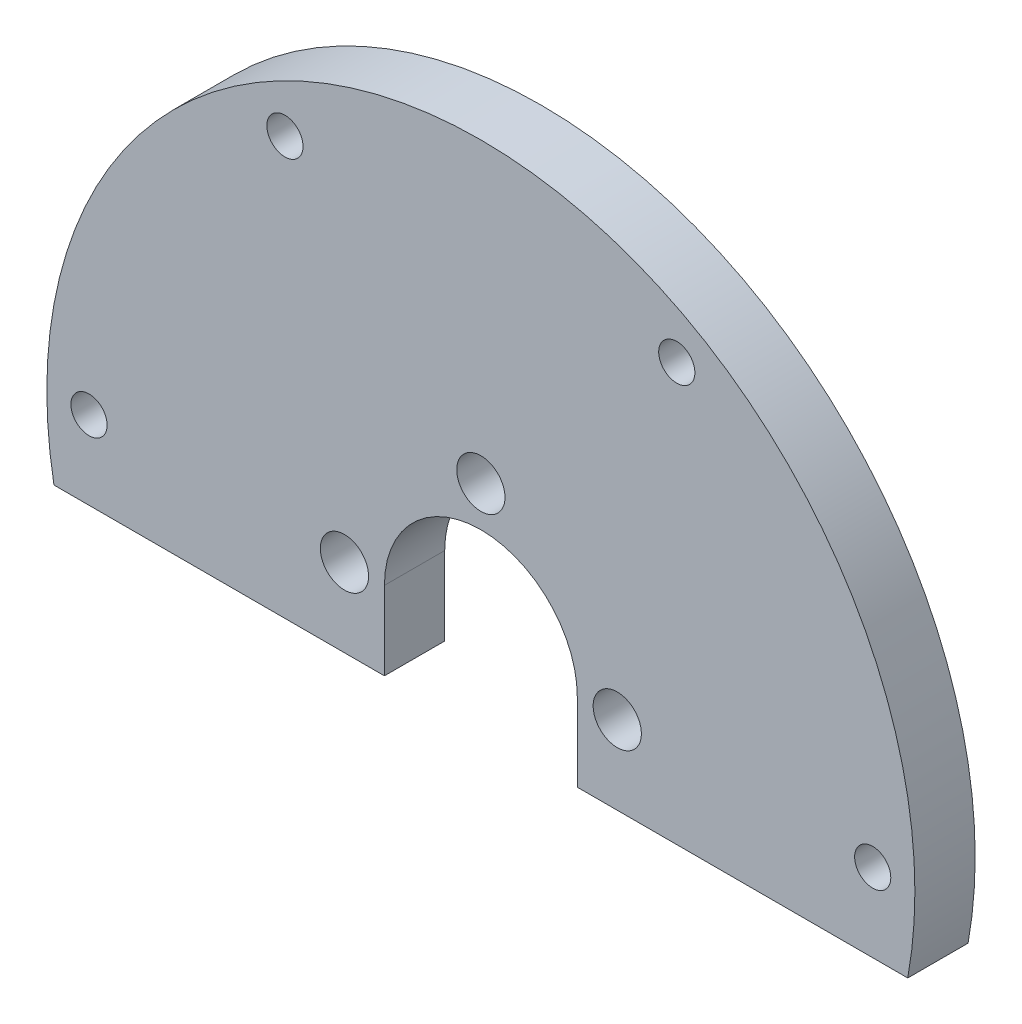
ISO-10303-21;
HEADER;
FILE_DESCRIPTION(('STEP AP214'),'2;1');
FILE_NAME('part.step','',(''),(''),'','','');
FILE_SCHEMA(('AUTOMOTIVE_DESIGN { 1 0 10303 214 1 1 1 1 }'));
ENDSEC;
DATA;
#1=APPLICATION_CONTEXT('core data for automotive mechanical design processes');
#2=APPLICATION_PROTOCOL_DEFINITION('international standard','automotive_design',2000,#1);
#3=PRODUCT_CONTEXT('',#1,'mechanical');
#4=PRODUCT('Part','Part','',(#3));
#5=PRODUCT_RELATED_PRODUCT_CATEGORY('part','',(#4));
#6=PRODUCT_DEFINITION_FORMATION('','',#4);
#7=PRODUCT_DEFINITION_CONTEXT('part definition',#1,'design');
#8=PRODUCT_DEFINITION('design','',#6,#7);
#9=PRODUCT_DEFINITION_SHAPE('','',#8);
#10=(LENGTH_UNIT() NAMED_UNIT(*) SI_UNIT(.MILLI.,.METRE.));
#11=(NAMED_UNIT(*) PLANE_ANGLE_UNIT() SI_UNIT($,.RADIAN.));
#12=(NAMED_UNIT(*) SI_UNIT($,.STERADIAN.) SOLID_ANGLE_UNIT());
#13=UNCERTAINTY_MEASURE_WITH_UNIT(LENGTH_MEASURE(1.E-05),#10,'distance_accuracy_value','');
#14=(GEOMETRIC_REPRESENTATION_CONTEXT(3) GLOBAL_UNCERTAINTY_ASSIGNED_CONTEXT((#13)) GLOBAL_UNIT_ASSIGNED_CONTEXT((#10,
#11,#12)) REPRESENTATION_CONTEXT('',''));
#15=CARTESIAN_POINT('',(0.,0.,0.));
#16=DIRECTION('',(0.,0.,1.));
#17=DIRECTION('',(1.,0.,0.));
#18=AXIS2_PLACEMENT_3D('',#15,#16,#17);
#19=CARTESIAN_POINT('',(-7.99860429450443,0.,5.));
#20=DIRECTION('',(1.,0.,0.));
#21=DIRECTION('',(0.,0.,-1.));
#22=AXIS2_PLACEMENT_3D('',#19,#20,#21);
#23=PLANE('',#22);
#24=DIRECTION('',(0.,-1.,0.));
#25=VECTOR('',#24,1.);
#26=CARTESIAN_POINT('',(-7.99860429450443,0.,0.));
#27=LINE('',#26,#25);
#28=CARTESIAN_POINT('',(-7.99860429450443,0.,0.));
#29=VERTEX_POINT('',#28);
#30=CARTESIAN_POINT('',(-7.99860429450443,-6.50000000000001,0.));
#31=VERTEX_POINT('',#30);
#32=EDGE_CURVE('E136',#29,#31,#27,.T.);
#33=ORIENTED_EDGE('',*,*,#32,.F.);
#34=DIRECTION('',(0.,0.,-1.));
#35=VECTOR('',#34,1.);
#36=CARTESIAN_POINT('',(-7.99860429450443,0.,5.));
#37=LINE('',#36,#35);
#38=CARTESIAN_POINT('',(-7.99860429450443,0.,5.));
#39=VERTEX_POINT('',#38);
#40=EDGE_CURVE('E11',#39,#29,#37,.T.);
#41=ORIENTED_EDGE('',*,*,#40,.F.);
#42=DIRECTION('',(0.,-1.,0.));
#43=VECTOR('',#42,1.);
#44=CARTESIAN_POINT('',(-7.99860429450443,0.,5.));
#45=LINE('',#44,#43);
#46=CARTESIAN_POINT('',(-7.99860429450443,-6.50000000000001,5.));
#47=VERTEX_POINT('',#46);
#48=EDGE_CURVE('E184',#39,#47,#45,.T.);
#49=ORIENTED_EDGE('',*,*,#48,.T.);
#50=DIRECTION('',(0.,0.,-1.));
#51=VECTOR('',#50,1.);
#52=CARTESIAN_POINT('',(-7.99860429450443,-6.50000000000001,5.));
#53=LINE('',#52,#51);
#54=EDGE_CURVE('E79',#47,#31,#53,.T.);
#55=ORIENTED_EDGE('',*,*,#54,.T.);
#56=EDGE_LOOP('',(#33,#41,#49,#55));
#57=FACE_BOUND('',#56,.T.);
#58=ADVANCED_FACE('F34',(#57),#23,.T.);
#59=CARTESIAN_POINT('',(1.76941794549634E-13,2.81025203108243E-13,5.));
#60=DIRECTION('',(0.,0.,-1.));
#61=DIRECTION('',(-1.,0.,0.));
#62=AXIS2_PLACEMENT_3D('',#59,#60,#61);
#63=CYLINDRICAL_SURFACE('',#62,7.99860429450443);
#64=CARTESIAN_POINT('',(1.76941794549634E-13,2.81025203108243E-13,0.));
#65=DIRECTION('',(0.,0.,1.));
#66=DIRECTION('',(1.,0.,0.));
#67=AXIS2_PLACEMENT_3D('',#64,#65,#66);
#68=CIRCLE('',#67,7.99860429450443);
#69=CARTESIAN_POINT('',(7.99860429450443,0.,0.));
#70=VERTEX_POINT('',#69);
#71=EDGE_CURVE('E139',#29,#70,#68,.F.);
#72=ORIENTED_EDGE('',*,*,#71,.T.);
#73=DIRECTION('',(0.,0.,-1.));
#74=VECTOR('',#73,1.);
#75=CARTESIAN_POINT('',(7.99860429450443,0.,5.));
#76=LINE('',#75,#74);
#77=CARTESIAN_POINT('',(7.99860429450443,0.,5.));
#78=VERTEX_POINT('',#77);
#79=EDGE_CURVE('E43',#78,#70,#76,.T.);
#80=ORIENTED_EDGE('',*,*,#79,.F.);
#81=CARTESIAN_POINT('',(1.76941794549634E-13,2.81025203108243E-13,5.));
#82=DIRECTION('',(0.,0.,1.));
#83=DIRECTION('',(1.,0.,0.));
#84=AXIS2_PLACEMENT_3D('',#81,#82,#83);
#85=CIRCLE('',#84,7.99860429450443);
#86=EDGE_CURVE('E186',#39,#78,#85,.F.);
#87=ORIENTED_EDGE('',*,*,#86,.F.);
#88=ORIENTED_EDGE('',*,*,#40,.T.);
#89=EDGE_LOOP('',(#72,#80,#87,#88));
#90=FACE_BOUND('',#89,.T.);
#91=ADVANCED_FACE('F157',(#90),#63,.F.);
#92=CARTESIAN_POINT('',(7.99860429450443,0.,5.));
#93=DIRECTION('',(-1.,0.,0.));
#94=DIRECTION('',(0.,0.,1.));
#95=AXIS2_PLACEMENT_3D('',#92,#93,#94);
#96=PLANE('',#95);
#97=DIRECTION('',(0.,1.,0.));
#98=VECTOR('',#97,1.);
#99=CARTESIAN_POINT('',(7.99860429450443,0.,0.));
#100=LINE('',#99,#98);
#101=CARTESIAN_POINT('',(7.99860429450443,-6.50000000000001,0.));
#102=VERTEX_POINT('',#101);
#103=EDGE_CURVE('E142',#102,#70,#100,.T.);
#104=ORIENTED_EDGE('',*,*,#103,.F.);
#105=DIRECTION('',(0.,0.,-1.));
#106=VECTOR('',#105,1.);
#107=CARTESIAN_POINT('',(7.99860429450443,-6.50000000000001,5.));
#108=LINE('',#107,#106);
#109=CARTESIAN_POINT('',(7.99860429450443,-6.50000000000001,5.));
#110=VERTEX_POINT('',#109);
#111=EDGE_CURVE('E109',#110,#102,#108,.T.);
#112=ORIENTED_EDGE('',*,*,#111,.F.);
#113=DIRECTION('',(0.,1.,0.));
#114=VECTOR('',#113,1.);
#115=CARTESIAN_POINT('',(7.99860429450443,0.,5.));
#116=LINE('',#115,#114);
#117=EDGE_CURVE('E98',#110,#78,#116,.T.);
#118=ORIENTED_EDGE('',*,*,#117,.T.);
#119=ORIENTED_EDGE('',*,*,#79,.T.);
#120=EDGE_LOOP('',(#104,#112,#118,#119));
#121=FACE_BOUND('',#120,.T.);
#122=ADVANCED_FACE('F154',(#121),#96,.T.);
#123=CARTESIAN_POINT('',(0.,-6.50000000000001,5.));
#124=DIRECTION('',(0.,1.,0.));
#125=DIRECTION('',(0.,0.,1.));
#126=AXIS2_PLACEMENT_3D('',#123,#124,#125);
#127=PLANE('',#126);
#128=DIRECTION('',(1.,0.,0.));
#129=VECTOR('',#128,1.);
#130=CARTESIAN_POINT('',(0.,-6.50000000000001,0.));
#131=LINE('',#130,#129);
#132=CARTESIAN_POINT('',(35.4083323527104,-6.50000000000001,0.));
#133=VERTEX_POINT('',#132);
#134=EDGE_CURVE('E105',#102,#133,#131,.T.);
#135=ORIENTED_EDGE('',*,*,#134,.T.);
#136=DIRECTION('',(0.,0.,-1.));
#137=VECTOR('',#136,1.);
#138=CARTESIAN_POINT('',(35.4083323527104,-6.50000000000001,5.));
#139=LINE('',#138,#137);
#140=CARTESIAN_POINT('',(35.4083323527104,-6.50000000000001,5.));
#141=VERTEX_POINT('',#140);
#142=EDGE_CURVE('E102',#141,#133,#139,.T.);
#143=ORIENTED_EDGE('',*,*,#142,.F.);
#144=DIRECTION('',(1.,0.,0.));
#145=VECTOR('',#144,1.);
#146=CARTESIAN_POINT('',(0.,-6.50000000000001,5.));
#147=LINE('',#146,#145);
#148=EDGE_CURVE('E92',#110,#141,#147,.T.);
#149=ORIENTED_EDGE('',*,*,#148,.F.);
#150=ORIENTED_EDGE('',*,*,#111,.T.);
#151=EDGE_LOOP('',(#135,#143,#149,#150));
#152=FACE_BOUND('',#151,.T.);
#153=ADVANCED_FACE('F103',(#152),#127,.F.);
#154=CARTESIAN_POINT('',(1.76941794549634E-13,2.81025203108243E-13,5.));
#155=DIRECTION('',(0.,0.,-1.));
#156=DIRECTION('',(-1.,0.,0.));
#157=AXIS2_PLACEMENT_3D('',#154,#155,#156);
#158=CYLINDRICAL_SURFACE('',#157,36.);
#159=CARTESIAN_POINT('',(1.76941794549634E-13,2.81025203108243E-13,0.));
#160=DIRECTION('',(0.,0.,1.));
#161=DIRECTION('',(1.,0.,0.));
#162=AXIS2_PLACEMENT_3D('',#159,#160,#161);
#163=CIRCLE('',#162,36.);
#164=CARTESIAN_POINT('',(-35.4083323527104,-6.50000000000001,0.));
#165=VERTEX_POINT('',#164);
#166=EDGE_CURVE('E146',#165,#133,#163,.F.);
#167=ORIENTED_EDGE('',*,*,#166,.F.);
#168=DIRECTION('',(0.,0.,-1.));
#169=VECTOR('',#168,1.);
#170=CARTESIAN_POINT('',(-35.4083323527104,-6.50000000000001,5.));
#171=LINE('',#170,#169);
#172=CARTESIAN_POINT('',(-35.4083323527104,-6.50000000000001,5.));
#173=VERTEX_POINT('',#172);
#174=EDGE_CURVE('E72',#173,#165,#171,.T.);
#175=ORIENTED_EDGE('',*,*,#174,.F.);
#176=CARTESIAN_POINT('',(1.76941794549634E-13,2.81025203108243E-13,5.));
#177=DIRECTION('',(0.,0.,1.));
#178=DIRECTION('',(1.,0.,0.));
#179=AXIS2_PLACEMENT_3D('',#176,#177,#178);
#180=CIRCLE('',#179,36.);
#181=EDGE_CURVE('E96',#173,#141,#180,.F.);
#182=ORIENTED_EDGE('',*,*,#181,.T.);
#183=ORIENTED_EDGE('',*,*,#142,.T.);
#184=EDGE_LOOP('',(#167,#175,#182,#183));
#185=FACE_BOUND('',#184,.T.);
#186=ADVANCED_FACE('F111',(#185),#158,.T.);
#187=CARTESIAN_POINT('',(-32.5,0.,5.));
#188=DIRECTION('',(0.,0.,-1.));
#189=DIRECTION('',(-1.,0.,0.));
#190=AXIS2_PLACEMENT_3D('',#187,#188,#189);
#191=CYLINDRICAL_SURFACE('',#190,1.5);
#192=CARTESIAN_POINT('',(-32.5,0.,5.));
#193=DIRECTION('',(0.,0.,1.));
#194=DIRECTION('',(1.,0.,0.));
#195=AXIS2_PLACEMENT_3D('',#192,#193,#194);
#196=CIRCLE('',#195,1.5);
#197=CARTESIAN_POINT('',(-31.,0.,5.));
#198=VERTEX_POINT('',#197);
#199=EDGE_CURVE('E181',#198,#198,#196,.T.);
#200=ORIENTED_EDGE('',*,*,#199,.T.);
#201=EDGE_LOOP('',(#200));
#202=FACE_BOUND('',#201,.T.);
#203=CARTESIAN_POINT('',(-32.5,0.,0.));
#204=DIRECTION('',(0.,0.,1.));
#205=DIRECTION('',(1.,0.,0.));
#206=AXIS2_PLACEMENT_3D('',#203,#204,#205);
#207=CIRCLE('',#206,1.5);
#208=CARTESIAN_POINT('',(-31.,0.,0.));
#209=VERTEX_POINT('',#208);
#210=EDGE_CURVE('E133',#209,#209,#207,.T.);
#211=ORIENTED_EDGE('',*,*,#210,.F.);
#212=EDGE_LOOP('',(#211));
#213=FACE_BOUND('',#212,.T.);
#214=ADVANCED_FACE('F195',(#202,#213),#191,.F.);
#215=CARTESIAN_POINT('',(-16.25,28.1458256229943,5.));
#216=DIRECTION('',(0.,0.,-1.));
#217=DIRECTION('',(-1.,0.,0.));
#218=AXIS2_PLACEMENT_3D('',#215,#216,#217);
#219=CYLINDRICAL_SURFACE('',#218,1.5);
#220=CARTESIAN_POINT('',(-16.25,28.1458256229943,5.));
#221=DIRECTION('',(0.,0.,1.));
#222=DIRECTION('',(1.,0.,0.));
#223=AXIS2_PLACEMENT_3D('',#220,#221,#222);
#224=CIRCLE('',#223,1.5);
#225=CARTESIAN_POINT('',(-14.7499999999999,28.1458256229943,5.));
#226=VERTEX_POINT('',#225);
#227=EDGE_CURVE('E178',#226,#226,#224,.T.);
#228=ORIENTED_EDGE('',*,*,#227,.T.);
#229=EDGE_LOOP('',(#228));
#230=FACE_BOUND('',#229,.T.);
#231=CARTESIAN_POINT('',(-16.25,28.1458256229943,0.));
#232=DIRECTION('',(0.,0.,1.));
#233=DIRECTION('',(1.,0.,0.));
#234=AXIS2_PLACEMENT_3D('',#231,#232,#233);
#235=CIRCLE('',#234,1.5);
#236=CARTESIAN_POINT('',(-14.7499999999999,28.1458256229943,0.));
#237=VERTEX_POINT('',#236);
#238=EDGE_CURVE('E130',#237,#237,#235,.T.);
#239=ORIENTED_EDGE('',*,*,#238,.F.);
#240=EDGE_LOOP('',(#239));
#241=FACE_BOUND('',#240,.T.);
#242=ADVANCED_FACE('F198',(#230,#241),#219,.F.);
#243=CARTESIAN_POINT('',(16.2500000000001,28.1458256229942,5.));
#244=DIRECTION('',(0.,0.,-1.));
#245=DIRECTION('',(-1.,0.,0.));
#246=AXIS2_PLACEMENT_3D('',#243,#244,#245);
#247=CYLINDRICAL_SURFACE('',#246,1.5);
#248=CARTESIAN_POINT('',(16.2500000000001,28.1458256229942,5.));
#249=DIRECTION('',(0.,0.,1.));
#250=DIRECTION('',(1.,0.,0.));
#251=AXIS2_PLACEMENT_3D('',#248,#249,#250);
#252=CIRCLE('',#251,1.5);
#253=CARTESIAN_POINT('',(17.7500000000001,28.1458256229942,5.));
#254=VERTEX_POINT('',#253);
#255=EDGE_CURVE('E175',#254,#254,#252,.T.);
#256=ORIENTED_EDGE('',*,*,#255,.T.);
#257=EDGE_LOOP('',(#256));
#258=FACE_BOUND('',#257,.T.);
#259=CARTESIAN_POINT('',(16.2500000000001,28.1458256229942,0.));
#260=DIRECTION('',(0.,0.,1.));
#261=DIRECTION('',(1.,0.,0.));
#262=AXIS2_PLACEMENT_3D('',#259,#260,#261);
#263=CIRCLE('',#262,1.5);
#264=CARTESIAN_POINT('',(17.7500000000001,28.1458256229942,0.));
#265=VERTEX_POINT('',#264);
#266=EDGE_CURVE('E127',#265,#265,#263,.T.);
#267=ORIENTED_EDGE('',*,*,#266,.F.);
#268=EDGE_LOOP('',(#267));
#269=FACE_BOUND('',#268,.T.);
#270=ADVANCED_FACE('F202',(#258,#269),#247,.F.);
#271=CARTESIAN_POINT('',(32.5,-1.83013326715553E-13,5.));
#272=DIRECTION('',(0.,0.,-1.));
#273=DIRECTION('',(-1.,0.,0.));
#274=AXIS2_PLACEMENT_3D('',#271,#272,#273);
#275=CYLINDRICAL_SURFACE('',#274,1.5);
#276=CARTESIAN_POINT('',(32.5,-1.83013326715553E-13,5.));
#277=DIRECTION('',(0.,0.,1.));
#278=DIRECTION('',(1.,0.,0.));
#279=AXIS2_PLACEMENT_3D('',#276,#277,#278);
#280=CIRCLE('',#279,1.5);
#281=CARTESIAN_POINT('',(34.,-1.83013326715553E-13,5.));
#282=VERTEX_POINT('',#281);
#283=EDGE_CURVE('E172',#282,#282,#280,.T.);
#284=ORIENTED_EDGE('',*,*,#283,.T.);
#285=EDGE_LOOP('',(#284));
#286=FACE_BOUND('',#285,.T.);
#287=CARTESIAN_POINT('',(32.5,-1.83013326715553E-13,0.));
#288=DIRECTION('',(0.,0.,1.));
#289=DIRECTION('',(1.,0.,0.));
#290=AXIS2_PLACEMENT_3D('',#287,#288,#289);
#291=CIRCLE('',#290,1.5);
#292=CARTESIAN_POINT('',(34.,-1.83013326715553E-13,0.));
#293=VERTEX_POINT('',#292);
#294=EDGE_CURVE('E124',#293,#293,#291,.T.);
#295=ORIENTED_EDGE('',*,*,#294,.F.);
#296=EDGE_LOOP('',(#295));
#297=FACE_BOUND('',#296,.T.);
#298=ADVANCED_FACE('F206',(#286,#297),#275,.F.);
#299=CARTESIAN_POINT('',(0.,11.3137084989848,5.));
#300=DIRECTION('',(0.,0.,-1.));
#301=DIRECTION('',(-1.,0.,0.));
#302=AXIS2_PLACEMENT_3D('',#299,#300,#301);
#303=CYLINDRICAL_SURFACE('',#302,1.99999999999233);
#304=CARTESIAN_POINT('',(0.,11.3137084989848,5.));
#305=DIRECTION('',(0.,0.,1.));
#306=DIRECTION('',(1.,0.,0.));
#307=AXIS2_PLACEMENT_3D('',#304,#305,#306);
#308=CIRCLE('',#307,1.99999999999233);
#309=CARTESIAN_POINT('',(1.99999999999233,11.3137084989848,5.));
#310=VERTEX_POINT('',#309);
#311=EDGE_CURVE('E167',#310,#310,#308,.T.);
#312=ORIENTED_EDGE('',*,*,#311,.T.);
#313=EDGE_LOOP('',(#312));
#314=FACE_BOUND('',#313,.T.);
#315=CARTESIAN_POINT('',(0.,11.3137084989848,0.));
#316=DIRECTION('',(0.,0.,1.));
#317=DIRECTION('',(1.,0.,0.));
#318=AXIS2_PLACEMENT_3D('',#315,#316,#317);
#319=CIRCLE('',#318,1.99999999999233);
#320=CARTESIAN_POINT('',(1.99999999999233,11.3137084989848,0.));
#321=VERTEX_POINT('',#320);
#322=EDGE_CURVE('E121',#321,#321,#319,.T.);
#323=ORIENTED_EDGE('',*,*,#322,.F.);
#324=EDGE_LOOP('',(#323));
#325=FACE_BOUND('',#324,.T.);
#326=ADVANCED_FACE('F210',(#314,#325),#303,.F.);
#327=CARTESIAN_POINT('',(11.3137084989848,0.,5.));
#328=DIRECTION('',(0.,0.,-1.));
#329=DIRECTION('',(-1.,0.,0.));
#330=AXIS2_PLACEMENT_3D('',#327,#328,#329);
#331=CYLINDRICAL_SURFACE('',#330,2.00000000000247);
#332=CARTESIAN_POINT('',(11.3137084989848,0.,5.));
#333=DIRECTION('',(0.,0.,1.));
#334=DIRECTION('',(1.,0.,0.));
#335=AXIS2_PLACEMENT_3D('',#332,#333,#334);
#336=CIRCLE('',#335,2.00000000000247);
#337=CARTESIAN_POINT('',(13.3137084989872,0.,5.));
#338=VERTEX_POINT('',#337);
#339=EDGE_CURVE('E162',#338,#338,#336,.T.);
#340=ORIENTED_EDGE('',*,*,#339,.T.);
#341=EDGE_LOOP('',(#340));
#342=FACE_BOUND('',#341,.T.);
#343=CARTESIAN_POINT('',(11.3137084989848,0.,0.));
#344=DIRECTION('',(0.,0.,1.));
#345=DIRECTION('',(1.,0.,0.));
#346=AXIS2_PLACEMENT_3D('',#343,#344,#345);
#347=CIRCLE('',#346,2.00000000000247);
#348=CARTESIAN_POINT('',(13.3137084989872,0.,0.));
#349=VERTEX_POINT('',#348);
#350=EDGE_CURVE('E118',#349,#349,#347,.T.);
#351=ORIENTED_EDGE('',*,*,#350,.F.);
#352=EDGE_LOOP('',(#351));
#353=FACE_BOUND('',#352,.T.);
#354=ADVANCED_FACE('F213',(#342,#353),#331,.F.);
#355=CARTESIAN_POINT('',(-11.3137084989848,0.,5.));
#356=DIRECTION('',(0.,0.,-1.));
#357=DIRECTION('',(-1.,0.,0.));
#358=AXIS2_PLACEMENT_3D('',#355,#356,#357);
#359=CYLINDRICAL_SURFACE('',#358,1.99999999999778);
#360=CARTESIAN_POINT('',(-11.3137084989848,0.,5.));
#361=DIRECTION('',(0.,0.,1.));
#362=DIRECTION('',(1.,0.,0.));
#363=AXIS2_PLACEMENT_3D('',#360,#361,#362);
#364=CIRCLE('',#363,1.99999999999778);
#365=CARTESIAN_POINT('',(-9.31370849898698,0.,5.));
#366=VERTEX_POINT('',#365);
#367=EDGE_CURVE('E160',#366,#366,#364,.T.);
#368=ORIENTED_EDGE('',*,*,#367,.T.);
#369=EDGE_LOOP('',(#368));
#370=FACE_BOUND('',#369,.T.);
#371=CARTESIAN_POINT('',(-11.3137084989848,0.,0.));
#372=DIRECTION('',(0.,0.,1.));
#373=DIRECTION('',(1.,0.,0.));
#374=AXIS2_PLACEMENT_3D('',#371,#372,#373);
#375=CIRCLE('',#374,1.99999999999778);
#376=CARTESIAN_POINT('',(-9.31370849898698,0.,0.));
#377=VERTEX_POINT('',#376);
#378=EDGE_CURVE('E115',#377,#377,#375,.T.);
#379=ORIENTED_EDGE('',*,*,#378,.F.);
#380=EDGE_LOOP('',(#379));
#381=FACE_BOUND('',#380,.T.);
#382=ADVANCED_FACE('F36',(#370,#381),#359,.F.);
#383=EDGE_CURVE('E147',#165,#31,#131,.T.);
#384=ORIENTED_EDGE('',*,*,#383,.T.);
#385=ORIENTED_EDGE('',*,*,#54,.F.);
#386=EDGE_CURVE('E51',#173,#47,#147,.T.);
#387=ORIENTED_EDGE('',*,*,#386,.F.);
#388=ORIENTED_EDGE('',*,*,#174,.T.);
#389=EDGE_LOOP('',(#384,#385,#387,#388));
#390=FACE_BOUND('',#389,.T.);
#391=ADVANCED_FACE('F220',(#390),#127,.F.);
#392=CARTESIAN_POINT('',(0.,0.,5.));
#393=DIRECTION('',(0.,0.,1.));
#394=DIRECTION('',(1.,0.,0.));
#395=AXIS2_PLACEMENT_3D('',#392,#393,#394);
#396=PLANE('',#395);
#397=ORIENTED_EDGE('',*,*,#367,.F.);
#398=EDGE_LOOP('',(#397));
#399=FACE_BOUND('',#398,.T.);
#400=ORIENTED_EDGE('',*,*,#339,.F.);
#401=EDGE_LOOP('',(#400));
#402=FACE_BOUND('',#401,.T.);
#403=ORIENTED_EDGE('',*,*,#311,.F.);
#404=EDGE_LOOP('',(#403));
#405=FACE_BOUND('',#404,.T.);
#406=ORIENTED_EDGE('',*,*,#283,.F.);
#407=EDGE_LOOP('',(#406));
#408=FACE_BOUND('',#407,.T.);
#409=ORIENTED_EDGE('',*,*,#255,.F.);
#410=EDGE_LOOP('',(#409));
#411=FACE_BOUND('',#410,.T.);
#412=ORIENTED_EDGE('',*,*,#227,.F.);
#413=EDGE_LOOP('',(#412));
#414=FACE_BOUND('',#413,.T.);
#415=ORIENTED_EDGE('',*,*,#199,.F.);
#416=EDGE_LOOP('',(#415));
#417=FACE_BOUND('',#416,.T.);
#418=ORIENTED_EDGE('',*,*,#48,.F.);
#419=ORIENTED_EDGE('',*,*,#86,.T.);
#420=ORIENTED_EDGE('',*,*,#117,.F.);
#421=ORIENTED_EDGE('',*,*,#148,.T.);
#422=ORIENTED_EDGE('',*,*,#181,.F.);
#423=ORIENTED_EDGE('',*,*,#386,.T.);
#424=EDGE_LOOP('',(#418,#419,#420,#421,#422,#423));
#425=FACE_BOUND('',#424,.T.);
#426=ADVANCED_FACE('F94',(#399,#402,#405,#408,#411,#414,#417,#425),#396,.T.);
#427=CARTESIAN_POINT('',(0.,0.,0.));
#428=DIRECTION('',(0.,0.,1.));
#429=DIRECTION('',(1.,0.,0.));
#430=AXIS2_PLACEMENT_3D('',#427,#428,#429);
#431=PLANE('',#430);
#432=ORIENTED_EDGE('',*,*,#378,.T.);
#433=EDGE_LOOP('',(#432));
#434=FACE_BOUND('',#433,.T.);
#435=ORIENTED_EDGE('',*,*,#350,.T.);
#436=EDGE_LOOP('',(#435));
#437=FACE_BOUND('',#436,.T.);
#438=ORIENTED_EDGE('',*,*,#322,.T.);
#439=EDGE_LOOP('',(#438));
#440=FACE_BOUND('',#439,.T.);
#441=ORIENTED_EDGE('',*,*,#294,.T.);
#442=EDGE_LOOP('',(#441));
#443=FACE_BOUND('',#442,.T.);
#444=ORIENTED_EDGE('',*,*,#266,.T.);
#445=EDGE_LOOP('',(#444));
#446=FACE_BOUND('',#445,.T.);
#447=ORIENTED_EDGE('',*,*,#238,.T.);
#448=EDGE_LOOP('',(#447));
#449=FACE_BOUND('',#448,.T.);
#450=ORIENTED_EDGE('',*,*,#210,.T.);
#451=EDGE_LOOP('',(#450));
#452=FACE_BOUND('',#451,.T.);
#453=ORIENTED_EDGE('',*,*,#32,.T.);
#454=ORIENTED_EDGE('',*,*,#383,.F.);
#455=ORIENTED_EDGE('',*,*,#166,.T.);
#456=ORIENTED_EDGE('',*,*,#134,.F.);
#457=ORIENTED_EDGE('',*,*,#103,.T.);
#458=ORIENTED_EDGE('',*,*,#71,.F.);
#459=EDGE_LOOP('',(#453,#454,#455,#456,#457,#458));
#460=FACE_BOUND('',#459,.T.);
#461=ADVANCED_FACE('F159',(#434,#437,#440,#443,#446,#449,#452,#460),#431,.F.);
#462=CLOSED_SHELL('',(#58,#91,#122,#153,#186,#214,#242,#270,#298,#326,#354,#382,#391,#426,#461));
#463=MANIFOLD_SOLID_BREP('B2',#462);
#464=ADVANCED_BREP_SHAPE_REPRESENTATION('',(#18,#463),#14);
#465=SHAPE_DEFINITION_REPRESENTATION(#9,#464);
ENDSEC;
END-ISO-10303-21;
